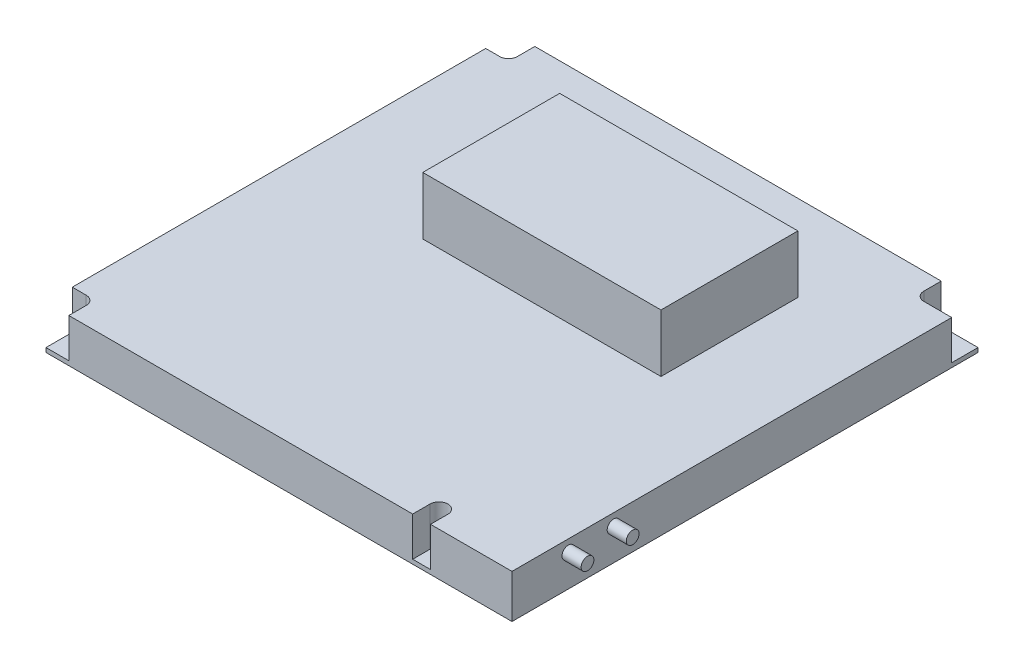
ISO-10303-21;
HEADER;
FILE_DESCRIPTION(('STEP AP214'),'2;1');
FILE_NAME('part.step','',(''),(''),'','','');
FILE_SCHEMA(('AUTOMOTIVE_DESIGN { 1 0 10303 214 1 1 1 1 }'));
ENDSEC;
DATA;
#1=APPLICATION_CONTEXT('core data for automotive mechanical design processes');
#2=APPLICATION_PROTOCOL_DEFINITION('international standard','automotive_design',2000,#1);
#3=PRODUCT_CONTEXT('',#1,'mechanical');
#4=PRODUCT('Part','Part','',(#3));
#5=PRODUCT_RELATED_PRODUCT_CATEGORY('part','',(#4));
#6=PRODUCT_DEFINITION_FORMATION('','',#4);
#7=PRODUCT_DEFINITION_CONTEXT('part definition',#1,'design');
#8=PRODUCT_DEFINITION('design','',#6,#7);
#9=PRODUCT_DEFINITION_SHAPE('','',#8);
#10=(LENGTH_UNIT() NAMED_UNIT(*) SI_UNIT(.MILLI.,.METRE.));
#11=(NAMED_UNIT(*) PLANE_ANGLE_UNIT() SI_UNIT($,.RADIAN.));
#12=(NAMED_UNIT(*) SI_UNIT($,.STERADIAN.) SOLID_ANGLE_UNIT());
#13=UNCERTAINTY_MEASURE_WITH_UNIT(LENGTH_MEASURE(1.E-05),#10,'distance_accuracy_value','');
#14=(GEOMETRIC_REPRESENTATION_CONTEXT(3) GLOBAL_UNCERTAINTY_ASSIGNED_CONTEXT((#13)) GLOBAL_UNIT_ASSIGNED_CONTEXT((#10,
#11,#12)) REPRESENTATION_CONTEXT('',''));
#15=CARTESIAN_POINT('',(0.,0.,0.));
#16=DIRECTION('',(0.,0.,1.));
#17=DIRECTION('',(1.,0.,0.));
#18=AXIS2_PLACEMENT_3D('',#15,#16,#17);
#19=CARTESIAN_POINT('',(0.,15.875,0.));
#20=DIRECTION('',(0.,-1.,0.));
#21=DIRECTION('',(0.,0.,-1.));
#22=AXIS2_PLACEMENT_3D('',#19,#20,#21);
#23=PLANE('',#22);
#24=DIRECTION('',(1.,0.,0.));
#25=VECTOR('',#24,1.);
#26=CARTESIAN_POINT('',(-85.09,15.875,85.09));
#27=LINE('',#26,#25);
#28=CARTESIAN_POINT('',(-76.7588,15.875,85.09));
#29=VERTEX_POINT('',#28);
#30=CARTESIAN_POINT('',(48.8188,15.875,85.09));
#31=VERTEX_POINT('',#30);
#32=EDGE_CURVE('E375',#29,#31,#27,.T.);
#33=ORIENTED_EDGE('',*,*,#32,.T.);
#34=DIRECTION('',(0.,0.,1.));
#35=VECTOR('',#34,1.);
#36=CARTESIAN_POINT('',(48.8188,15.875,78.74));
#37=LINE('',#36,#35);
#38=CARTESIAN_POINT('',(48.8188,15.875,78.74));
#39=VERTEX_POINT('',#38);
#40=EDGE_CURVE('E238',#39,#31,#37,.T.);
#41=ORIENTED_EDGE('',*,*,#40,.F.);
#42=CARTESIAN_POINT('',(52.07,15.875,78.74));
#43=DIRECTION('',(0.,1.,0.));
#44=DIRECTION('',(0.,0.,1.));
#45=AXIS2_PLACEMENT_3D('',#42,#43,#44);
#46=CIRCLE('',#45,3.2512);
#47=CARTESIAN_POINT('',(55.3212,15.875,78.74));
#48=VERTEX_POINT('',#47);
#49=EDGE_CURVE('E240',#48,#39,#46,.T.);
#50=ORIENTED_EDGE('',*,*,#49,.F.);
#51=DIRECTION('',(0.,0.,-1.));
#52=VECTOR('',#51,1.);
#53=CARTESIAN_POINT('',(55.3212,15.875,85.09));
#54=LINE('',#53,#52);
#55=CARTESIAN_POINT('',(55.3212,15.875,85.09));
#56=VERTEX_POINT('',#55);
#57=EDGE_CURVE('E234',#56,#48,#54,.T.);
#58=ORIENTED_EDGE('',*,*,#57,.F.);
#59=CARTESIAN_POINT('',(85.09,15.875,85.09));
#60=VERTEX_POINT('',#59);
#61=EDGE_CURVE('E374',#56,#60,#27,.T.);
#62=ORIENTED_EDGE('',*,*,#61,.T.);
#63=DIRECTION('',(0.,0.,-1.));
#64=VECTOR('',#63,1.);
#65=CARTESIAN_POINT('',(85.09,15.875,85.09));
#66=LINE('',#65,#64);
#67=CARTESIAN_POINT('',(85.09,15.875,-75.4888));
#68=VERTEX_POINT('',#67);
#69=EDGE_CURVE('E365',#60,#68,#66,.T.);
#70=ORIENTED_EDGE('',*,*,#69,.T.);
#71=DIRECTION('',(1.,0.,0.));
#72=VECTOR('',#71,1.);
#73=CARTESIAN_POINT('',(85.09,15.875,-75.4888));
#74=LINE('',#73,#72);
#75=CARTESIAN_POINT('',(74.91000004,15.875,-75.4888));
#76=VERTEX_POINT('',#75);
#77=EDGE_CURVE('E268',#76,#68,#74,.T.);
#78=ORIENTED_EDGE('',*,*,#77,.F.);
#79=CARTESIAN_POINT('',(74.91000004,15.875,-78.74));
#80=DIRECTION('',(0.,1.,0.));
#81=DIRECTION('',(0.,0.,1.));
#82=AXIS2_PLACEMENT_3D('',#79,#80,#81);
#83=CIRCLE('',#82,3.2512);
#84=CARTESIAN_POINT('',(71.65880004,15.875,-78.74));
#85=VERTEX_POINT('',#84);
#86=EDGE_CURVE('E270',#85,#76,#83,.T.);
#87=ORIENTED_EDGE('',*,*,#86,.F.);
#88=DIRECTION('',(0.,0.,1.));
#89=VECTOR('',#88,1.);
#90=CARTESIAN_POINT('',(71.65880004,15.875,-78.74));
#91=LINE('',#90,#89);
#92=CARTESIAN_POINT('',(71.65880004,15.875,-85.09));
#93=VERTEX_POINT('',#92);
#94=EDGE_CURVE('E264',#93,#85,#91,.T.);
#95=ORIENTED_EDGE('',*,*,#94,.F.);
#96=DIRECTION('',(-1.,0.,0.));
#97=VECTOR('',#96,1.);
#98=CARTESIAN_POINT('',(-85.09,15.875,-85.09));
#99=LINE('',#98,#97);
#100=CARTESIAN_POINT('',(-76.7588,15.875,-85.09));
#101=VERTEX_POINT('',#100);
#102=EDGE_CURVE('E368',#93,#101,#99,.T.);
#103=ORIENTED_EDGE('',*,*,#102,.T.);
#104=DIRECTION('',(0.,0.,-1.));
#105=VECTOR('',#104,1.);
#106=CARTESIAN_POINT('',(-76.7588,15.875,-78.74));
#107=LINE('',#106,#105);
#108=CARTESIAN_POINT('',(-76.7588,15.875,-78.74));
#109=VERTEX_POINT('',#108);
#110=EDGE_CURVE('E228',#109,#101,#107,.T.);
#111=ORIENTED_EDGE('',*,*,#110,.F.);
#112=CARTESIAN_POINT('',(-80.01,15.875,-78.74));
#113=DIRECTION('',(0.,1.,0.));
#114=DIRECTION('',(0.,0.,1.));
#115=AXIS2_PLACEMENT_3D('',#112,#113,#114);
#116=CIRCLE('',#115,3.2512);
#117=CARTESIAN_POINT('',(-80.01,15.875,-75.4888));
#118=VERTEX_POINT('',#117);
#119=EDGE_CURVE('E225',#118,#109,#116,.T.);
#120=ORIENTED_EDGE('',*,*,#119,.F.);
#121=DIRECTION('',(1.,0.,0.));
#122=VECTOR('',#121,1.);
#123=CARTESIAN_POINT('',(-85.09,15.875,-75.4888));
#124=LINE('',#123,#122);
#125=CARTESIAN_POINT('',(-85.09,15.875,-75.4888));
#126=VERTEX_POINT('',#125);
#127=EDGE_CURVE('E294',#126,#118,#124,.T.);
#128=ORIENTED_EDGE('',*,*,#127,.F.);
#129=DIRECTION('',(0.,0.,1.));
#130=VECTOR('',#129,1.);
#131=CARTESIAN_POINT('',(-85.09,15.875,85.09));
#132=LINE('',#131,#130);
#133=CARTESIAN_POINT('',(-85.09,15.875,75.4888));
#134=VERTEX_POINT('',#133);
#135=EDGE_CURVE('E372',#126,#134,#132,.T.);
#136=ORIENTED_EDGE('',*,*,#135,.T.);
#137=DIRECTION('',(-1.,0.,0.));
#138=VECTOR('',#137,1.);
#139=CARTESIAN_POINT('',(-80.01,15.875,75.4888));
#140=LINE('',#139,#138);
#141=CARTESIAN_POINT('',(-80.01,15.875,75.4888));
#142=VERTEX_POINT('',#141);
#143=EDGE_CURVE('E323',#142,#134,#140,.T.);
#144=ORIENTED_EDGE('',*,*,#143,.F.);
#145=CARTESIAN_POINT('',(-80.01,15.875,78.74));
#146=DIRECTION('',(0.,1.,0.));
#147=DIRECTION('',(0.,0.,1.));
#148=AXIS2_PLACEMENT_3D('',#145,#146,#147);
#149=CIRCLE('',#148,3.2512);
#150=CARTESIAN_POINT('',(-76.7588,15.875,78.74));
#151=VERTEX_POINT('',#150);
#152=EDGE_CURVE('E326',#151,#142,#149,.T.);
#153=ORIENTED_EDGE('',*,*,#152,.F.);
#154=DIRECTION('',(0.,0.,-1.));
#155=VECTOR('',#154,1.);
#156=CARTESIAN_POINT('',(-76.7588,15.875,85.09));
#157=LINE('',#156,#155);
#158=EDGE_CURVE('E319',#29,#151,#157,.T.);
#159=ORIENTED_EDGE('',*,*,#158,.F.);
#160=EDGE_LOOP('',(#33,#41,#50,#58,#62,#70,#78,#87,#95,#103,#111,#120,#128,#136,#144,#153,#159));
#161=FACE_BOUND('',#160,.T.);
#162=DIRECTION('',(0.,0.,-1.));
#163=VECTOR('',#162,1.);
#164=CARTESIAN_POINT('',(50.669000008,15.875,-3.739999886));
#165=LINE('',#164,#163);
#166=CARTESIAN_POINT('',(50.669000008,15.875,-3.739999886));
#167=VERTEX_POINT('',#166);
#168=CARTESIAN_POINT('',(50.669000008,15.875,-53.739999962));
#169=VERTEX_POINT('',#168);
#170=EDGE_CURVE('E224',#167,#169,#165,.T.);
#171=ORIENTED_EDGE('',*,*,#170,.F.);
#172=DIRECTION('',(1.,0.,0.));
#173=VECTOR('',#172,1.);
#174=CARTESIAN_POINT('',(-36.330999982,15.875,-3.739999886));
#175=LINE('',#174,#173);
#176=CARTESIAN_POINT('',(-36.330999982,15.875,-3.739999886));
#177=VERTEX_POINT('',#176);
#178=EDGE_CURVE('E221',#177,#167,#175,.T.);
#179=ORIENTED_EDGE('',*,*,#178,.F.);
#180=DIRECTION('',(0.,0.,1.));
#181=VECTOR('',#180,1.);
#182=CARTESIAN_POINT('',(-36.330999982,15.875,-3.739999886));
#183=LINE('',#182,#181);
#184=CARTESIAN_POINT('',(-36.330999982,15.875,-53.739999962));
#185=VERTEX_POINT('',#184);
#186=EDGE_CURVE('E63',#185,#177,#183,.T.);
#187=ORIENTED_EDGE('',*,*,#186,.F.);
#188=DIRECTION('',(-1.,0.,0.));
#189=VECTOR('',#188,1.);
#190=CARTESIAN_POINT('',(-36.330999982,15.875,-53.739999962));
#191=LINE('',#190,#189);
#192=EDGE_CURVE('E58',#169,#185,#191,.T.);
#193=ORIENTED_EDGE('',*,*,#192,.F.);
#194=EDGE_LOOP('',(#171,#179,#187,#193));
#195=FACE_BOUND('',#194,.T.);
#196=ADVANCED_FACE('F43',(#161,#195),#23,.F.);
#197=CARTESIAN_POINT('',(0.,0.,0.));
#198=DIRECTION('',(0.,-1.,0.));
#199=DIRECTION('',(0.,0.,-1.));
#200=AXIS2_PLACEMENT_3D('',#197,#198,#199);
#201=PLANE('',#200);
#202=CARTESIAN_POINT('',(-80.01,0.,78.74));
#203=DIRECTION('',(0.,1.,0.));
#204=DIRECTION('',(0.,0.,1.));
#205=AXIS2_PLACEMENT_3D('',#202,#203,#204);
#206=CIRCLE('',#205,1.9750024);
#207=CARTESIAN_POINT('',(-80.01,0.,80.7150024));
#208=VERTEX_POINT('',#207);
#209=EDGE_CURVE('E355',#208,#208,#206,.T.);
#210=ORIENTED_EDGE('',*,*,#209,.T.);
#211=EDGE_LOOP('',(#210));
#212=FACE_BOUND('',#211,.T.);
#213=CARTESIAN_POINT('',(-80.01,0.,-78.74));
#214=DIRECTION('',(0.,1.,0.));
#215=DIRECTION('',(0.,0.,1.));
#216=AXIS2_PLACEMENT_3D('',#213,#214,#215);
#217=CIRCLE('',#216,1.9750024);
#218=CARTESIAN_POINT('',(-80.01,0.,-76.7649976));
#219=VERTEX_POINT('',#218);
#220=EDGE_CURVE('E361',#219,#219,#217,.T.);
#221=ORIENTED_EDGE('',*,*,#220,.T.);
#222=EDGE_LOOP('',(#221));
#223=FACE_BOUND('',#222,.T.);
#224=DIRECTION('',(0.,0.,-1.));
#225=VECTOR('',#224,1.);
#226=CARTESIAN_POINT('',(85.09,0.,85.09));
#227=LINE('',#226,#225);
#228=CARTESIAN_POINT('',(85.09,0.,85.09));
#229=VERTEX_POINT('',#228);
#230=CARTESIAN_POINT('',(85.09,0.,-85.09));
#231=VERTEX_POINT('',#230);
#232=EDGE_CURVE('E364',#229,#231,#227,.T.);
#233=ORIENTED_EDGE('',*,*,#232,.F.);
#234=DIRECTION('',(1.,0.,0.));
#235=VECTOR('',#234,1.);
#236=CARTESIAN_POINT('',(-85.09,0.,85.09));
#237=LINE('',#236,#235);
#238=CARTESIAN_POINT('',(-85.09,0.,85.09));
#239=VERTEX_POINT('',#238);
#240=EDGE_CURVE('E369',#239,#229,#237,.T.);
#241=ORIENTED_EDGE('',*,*,#240,.F.);
#242=DIRECTION('',(0.,0.,1.));
#243=VECTOR('',#242,1.);
#244=CARTESIAN_POINT('',(-85.09,0.,85.09));
#245=LINE('',#244,#243);
#246=CARTESIAN_POINT('',(-85.09,0.,-85.09));
#247=VERTEX_POINT('',#246);
#248=EDGE_CURVE('E384',#247,#239,#245,.T.);
#249=ORIENTED_EDGE('',*,*,#248,.F.);
#250=DIRECTION('',(-1.,0.,0.));
#251=VECTOR('',#250,1.);
#252=CARTESIAN_POINT('',(-85.09,0.,-85.09));
#253=LINE('',#252,#251);
#254=EDGE_CURVE('E381',#231,#247,#253,.T.);
#255=ORIENTED_EDGE('',*,*,#254,.F.);
#256=EDGE_LOOP('',(#233,#241,#249,#255));
#257=FACE_BOUND('',#256,.T.);
#258=CARTESIAN_POINT('',(74.91000004,0.,-78.74));
#259=DIRECTION('',(0.,1.,0.));
#260=DIRECTION('',(0.,0.,1.));
#261=AXIS2_PLACEMENT_3D('',#258,#259,#260);
#262=CIRCLE('',#261,1.9750024);
#263=CARTESIAN_POINT('',(74.91000004,0.,-76.7649976));
#264=VERTEX_POINT('',#263);
#265=EDGE_CURVE('E358',#264,#264,#262,.T.);
#266=ORIENTED_EDGE('',*,*,#265,.T.);
#267=EDGE_LOOP('',(#266));
#268=FACE_BOUND('',#267,.T.);
#269=CARTESIAN_POINT('',(52.07,0.,78.74));
#270=DIRECTION('',(0.,1.,0.));
#271=DIRECTION('',(0.,0.,1.));
#272=AXIS2_PLACEMENT_3D('',#269,#270,#271);
#273=CIRCLE('',#272,1.974999987);
#274=CARTESIAN_POINT('',(52.07,0.,80.714999987));
#275=VERTEX_POINT('',#274);
#276=EDGE_CURVE('E352',#275,#275,#273,.T.);
#277=ORIENTED_EDGE('',*,*,#276,.T.);
#278=EDGE_LOOP('',(#277));
#279=FACE_BOUND('',#278,.T.);
#280=ADVANCED_FACE('F412',(#212,#223,#257,#268,#279),#201,.T.);
#281=CARTESIAN_POINT('',(85.09,15.875,85.09));
#282=DIRECTION('',(-1.,0.,0.));
#283=DIRECTION('',(0.,0.,1.));
#284=AXIS2_PLACEMENT_3D('',#281,#282,#283);
#285=PLANE('',#284);
#286=CARTESIAN_POINT('',(85.09,11.574999964,48.009999992));
#287=DIRECTION('',(-1.,0.,0.));
#288=DIRECTION('',(0.,0.,1.));
#289=AXIS2_PLACEMENT_3D('',#286,#287,#288);
#290=CIRCLE('',#289,2.325000049);
#291=CARTESIAN_POINT('',(85.09,11.574999964,50.335000041));
#292=VERTEX_POINT('',#291);
#293=EDGE_CURVE('E12',#292,#292,#290,.F.);
#294=ORIENTED_EDGE('',*,*,#293,.F.);
#295=EDGE_LOOP('',(#294));
#296=FACE_BOUND('',#295,.T.);
#297=CARTESIAN_POINT('',(85.09,11.574999964,64.510000012));
#298=DIRECTION('',(-1.,0.,0.));
#299=DIRECTION('',(0.,0.,1.));
#300=AXIS2_PLACEMENT_3D('',#297,#298,#299);
#301=CIRCLE('',#300,2.32500004900001);
#302=CARTESIAN_POINT('',(85.09,11.574999964,66.835000061));
#303=VERTEX_POINT('',#302);
#304=EDGE_CURVE('E51',#303,#303,#301,.F.);
#305=ORIENTED_EDGE('',*,*,#304,.F.);
#306=EDGE_LOOP('',(#305));
#307=FACE_BOUND('',#306,.T.);
#308=DIRECTION('',(0.,-1.,0.));
#309=VECTOR('',#308,1.);
#310=CARTESIAN_POINT('',(85.09,15.875,-85.09));
#311=LINE('',#310,#309);
#312=CARTESIAN_POINT('',(85.09,1.574999898,-85.09));
#313=VERTEX_POINT('',#312);
#314=EDGE_CURVE('E394',#313,#231,#311,.T.);
#315=ORIENTED_EDGE('',*,*,#314,.F.);
#316=DIRECTION('',(0.,0.,-1.));
#317=VECTOR('',#316,1.);
#318=CARTESIAN_POINT('',(85.09,1.574999898,-85.09));
#319=LINE('',#318,#317);
#320=CARTESIAN_POINT('',(85.09,1.574999898,-75.4888));
#321=VERTEX_POINT('',#320);
#322=EDGE_CURVE('E287',#321,#313,#319,.T.);
#323=ORIENTED_EDGE('',*,*,#322,.F.);
#324=DIRECTION('',(0.,1.,0.));
#325=VECTOR('',#324,1.);
#326=CARTESIAN_POINT('',(85.09,-16.5100022351756,-75.4888));
#327=LINE('',#326,#325);
#328=EDGE_CURVE('E276',#321,#68,#327,.T.);
#329=ORIENTED_EDGE('',*,*,#328,.T.);
#330=ORIENTED_EDGE('',*,*,#69,.F.);
#331=DIRECTION('',(0.,-1.,0.));
#332=VECTOR('',#331,1.);
#333=CARTESIAN_POINT('',(85.09,15.875,85.09));
#334=LINE('',#333,#332);
#335=EDGE_CURVE('E378',#60,#229,#334,.T.);
#336=ORIENTED_EDGE('',*,*,#335,.T.);
#337=ORIENTED_EDGE('',*,*,#232,.T.);
#338=EDGE_LOOP('',(#315,#323,#329,#330,#336,#337));
#339=FACE_BOUND('',#338,.T.);
#340=ADVANCED_FACE('F45',(#296,#307,#339),#285,.F.);
#341=CARTESIAN_POINT('',(-85.09,15.875,-85.09));
#342=DIRECTION('',(0.,0.,1.));
#343=DIRECTION('',(1.,0.,0.));
#344=AXIS2_PLACEMENT_3D('',#341,#342,#343);
#345=PLANE('',#344);
#346=DIRECTION('',(0.,1.,0.));
#347=VECTOR('',#346,1.);
#348=CARTESIAN_POINT('',(71.65880004,-16.5100022351756,-85.09));
#349=LINE('',#348,#347);
#350=CARTESIAN_POINT('',(71.65880004,1.574999898,-85.09));
#351=VERTEX_POINT('',#350);
#352=EDGE_CURVE('E284',#351,#93,#349,.T.);
#353=ORIENTED_EDGE('',*,*,#352,.F.);
#354=DIRECTION('',(-1.,0.,0.));
#355=VECTOR('',#354,1.);
#356=CARTESIAN_POINT('',(71.65880004,1.574999898,-85.09));
#357=LINE('',#356,#355);
#358=EDGE_CURVE('E285',#313,#351,#357,.T.);
#359=ORIENTED_EDGE('',*,*,#358,.F.);
#360=ORIENTED_EDGE('',*,*,#314,.T.);
#361=ORIENTED_EDGE('',*,*,#254,.T.);
#362=DIRECTION('',(0.,-1.,0.));
#363=VECTOR('',#362,1.);
#364=CARTESIAN_POINT('',(-85.09,15.875,-85.09));
#365=LINE('',#364,#363);
#366=CARTESIAN_POINT('',(-85.09,1.574999898,-85.09));
#367=VERTEX_POINT('',#366);
#368=EDGE_CURVE('E392',#367,#247,#365,.T.);
#369=ORIENTED_EDGE('',*,*,#368,.F.);
#370=DIRECTION('',(-1.,0.,0.));
#371=VECTOR('',#370,1.);
#372=CARTESIAN_POINT('',(-76.7588,1.574999898,-85.09));
#373=LINE('',#372,#371);
#374=CARTESIAN_POINT('',(-76.7588,1.574999898,-85.09));
#375=VERTEX_POINT('',#374);
#376=EDGE_CURVE('E312',#375,#367,#373,.T.);
#377=ORIENTED_EDGE('',*,*,#376,.F.);
#378=DIRECTION('',(0.,1.,0.));
#379=VECTOR('',#378,1.);
#380=CARTESIAN_POINT('',(-76.7588,-16.5100022351756,-85.09));
#381=LINE('',#380,#379);
#382=EDGE_CURVE('E301',#375,#101,#381,.T.);
#383=ORIENTED_EDGE('',*,*,#382,.T.);
#384=ORIENTED_EDGE('',*,*,#102,.F.);
#385=EDGE_LOOP('',(#353,#359,#360,#361,#369,#377,#383,#384));
#386=FACE_BOUND('',#385,.T.);
#387=ADVANCED_FACE('F411',(#386),#345,.F.);
#388=CARTESIAN_POINT('',(-85.09,15.875,85.09));
#389=DIRECTION('',(1.,0.,0.));
#390=DIRECTION('',(0.,0.,-1.));
#391=AXIS2_PLACEMENT_3D('',#388,#389,#390);
#392=PLANE('',#391);
#393=DIRECTION('',(0.,1.,0.));
#394=VECTOR('',#393,1.);
#395=CARTESIAN_POINT('',(-85.09,-16.5100022351756,-75.4888));
#396=LINE('',#395,#394);
#397=CARTESIAN_POINT('',(-85.09,1.574999898,-75.4888));
#398=VERTEX_POINT('',#397);
#399=EDGE_CURVE('E309',#398,#126,#396,.T.);
#400=ORIENTED_EDGE('',*,*,#399,.F.);
#401=DIRECTION('',(0.,0.,1.));
#402=VECTOR('',#401,1.);
#403=CARTESIAN_POINT('',(-85.09,1.574999898,-85.09));
#404=LINE('',#403,#402);
#405=EDGE_CURVE('E310',#367,#398,#404,.T.);
#406=ORIENTED_EDGE('',*,*,#405,.F.);
#407=ORIENTED_EDGE('',*,*,#368,.T.);
#408=ORIENTED_EDGE('',*,*,#248,.T.);
#409=DIRECTION('',(0.,-1.,0.));
#410=VECTOR('',#409,1.);
#411=CARTESIAN_POINT('',(-85.09,15.875,85.09));
#412=LINE('',#411,#410);
#413=CARTESIAN_POINT('',(-85.09,1.574999898,85.09));
#414=VERTEX_POINT('',#413);
#415=EDGE_CURVE('E390',#414,#239,#412,.T.);
#416=ORIENTED_EDGE('',*,*,#415,.F.);
#417=DIRECTION('',(0.,0.,1.));
#418=VECTOR('',#417,1.);
#419=CARTESIAN_POINT('',(-85.09,1.574999898,75.4888));
#420=LINE('',#419,#418);
#421=CARTESIAN_POINT('',(-85.09,1.574999898,75.4888));
#422=VERTEX_POINT('',#421);
#423=EDGE_CURVE('E344',#422,#414,#420,.T.);
#424=ORIENTED_EDGE('',*,*,#423,.F.);
#425=DIRECTION('',(0.,1.,0.));
#426=VECTOR('',#425,1.);
#427=CARTESIAN_POINT('',(-85.09,-16.5100022351756,75.4888));
#428=LINE('',#427,#426);
#429=EDGE_CURVE('E332',#422,#134,#428,.T.);
#430=ORIENTED_EDGE('',*,*,#429,.T.);
#431=ORIENTED_EDGE('',*,*,#135,.F.);
#432=EDGE_LOOP('',(#400,#406,#407,#408,#416,#424,#430,#431));
#433=FACE_BOUND('',#432,.T.);
#434=ADVANCED_FACE('F429',(#433),#392,.F.);
#435=CARTESIAN_POINT('',(-85.09,15.875,85.09));
#436=DIRECTION('',(0.,0.,-1.));
#437=DIRECTION('',(-1.,0.,0.));
#438=AXIS2_PLACEMENT_3D('',#435,#436,#437);
#439=PLANE('',#438);
#440=DIRECTION('',(1.,0.,0.));
#441=VECTOR('',#440,1.);
#442=CARTESIAN_POINT('',(48.8188,1.574999898,85.09));
#443=LINE('',#442,#441);
#444=CARTESIAN_POINT('',(48.8188,1.574999898,85.09));
#445=VERTEX_POINT('',#444);
#446=CARTESIAN_POINT('',(55.3212,1.574999898,85.09));
#447=VERTEX_POINT('',#446);
#448=EDGE_CURVE('E256',#445,#447,#443,.T.);
#449=ORIENTED_EDGE('',*,*,#448,.F.);
#450=DIRECTION('',(0.,1.,0.));
#451=VECTOR('',#450,1.);
#452=CARTESIAN_POINT('',(48.8188,-16.5100022351756,85.09));
#453=LINE('',#452,#451);
#454=EDGE_CURVE('E246',#445,#31,#453,.T.);
#455=ORIENTED_EDGE('',*,*,#454,.T.);
#456=ORIENTED_EDGE('',*,*,#32,.F.);
#457=DIRECTION('',(0.,1.,0.));
#458=VECTOR('',#457,1.);
#459=CARTESIAN_POINT('',(-76.7588,-16.5100022351756,85.09));
#460=LINE('',#459,#458);
#461=CARTESIAN_POINT('',(-76.7588,1.574999898,85.09));
#462=VERTEX_POINT('',#461);
#463=EDGE_CURVE('E341',#462,#29,#460,.T.);
#464=ORIENTED_EDGE('',*,*,#463,.F.);
#465=DIRECTION('',(1.,0.,0.));
#466=VECTOR('',#465,1.);
#467=CARTESIAN_POINT('',(-85.09,1.574999898,85.09));
#468=LINE('',#467,#466);
#469=EDGE_CURVE('E342',#414,#462,#468,.T.);
#470=ORIENTED_EDGE('',*,*,#469,.F.);
#471=ORIENTED_EDGE('',*,*,#415,.T.);
#472=ORIENTED_EDGE('',*,*,#240,.T.);
#473=ORIENTED_EDGE('',*,*,#335,.F.);
#474=ORIENTED_EDGE('',*,*,#61,.F.);
#475=DIRECTION('',(0.,1.,0.));
#476=VECTOR('',#475,1.);
#477=CARTESIAN_POINT('',(55.3212,-16.5100022351756,85.09));
#478=LINE('',#477,#476);
#479=EDGE_CURVE('E255',#447,#56,#478,.T.);
#480=ORIENTED_EDGE('',*,*,#479,.F.);
#481=EDGE_LOOP('',(#449,#455,#456,#464,#470,#471,#472,#473,#474,#480));
#482=FACE_BOUND('',#481,.T.);
#483=ADVANCED_FACE('F464',(#482),#439,.F.);
#484=CARTESIAN_POINT('',(-80.01,15.875,-78.74));
#485=DIRECTION('',(0.,-1.,0.));
#486=DIRECTION('',(0.,0.,-1.));
#487=AXIS2_PLACEMENT_3D('',#484,#485,#486);
#488=CYLINDRICAL_SURFACE('',#487,1.9750024);
#489=CARTESIAN_POINT('',(-80.01,1.574999898,-78.74));
#490=DIRECTION('',(0.,-1.,0.));
#491=DIRECTION('',(0.,0.,-1.));
#492=AXIS2_PLACEMENT_3D('',#489,#490,#491);
#493=CIRCLE('',#492,1.9750024);
#494=CARTESIAN_POINT('',(-80.01,1.574999898,-80.7150024));
#495=VERTEX_POINT('',#494);
#496=EDGE_CURVE('E329',#495,#495,#493,.T.);
#497=ORIENTED_EDGE('',*,*,#496,.F.);
#498=EDGE_LOOP('',(#497));
#499=FACE_BOUND('',#498,.T.);
#500=ORIENTED_EDGE('',*,*,#220,.F.);
#501=EDGE_LOOP('',(#500));
#502=FACE_BOUND('',#501,.T.);
#503=ADVANCED_FACE('F505',(#499,#502),#488,.F.);
#504=CARTESIAN_POINT('',(74.91000004,15.875,-78.74));
#505=DIRECTION('',(0.,-1.,0.));
#506=DIRECTION('',(0.,0.,-1.));
#507=AXIS2_PLACEMENT_3D('',#504,#505,#506);
#508=CYLINDRICAL_SURFACE('',#507,1.9750024);
#509=CARTESIAN_POINT('',(74.91000004,1.574999898,-78.74));
#510=DIRECTION('',(0.,-1.,0.));
#511=DIRECTION('',(0.,0.,-1.));
#512=AXIS2_PLACEMENT_3D('',#509,#510,#511);
#513=CIRCLE('',#512,1.9750024);
#514=CARTESIAN_POINT('',(74.91000004,1.574999898,-80.7150024));
#515=VERTEX_POINT('',#514);
#516=EDGE_CURVE('E400',#515,#515,#513,.T.);
#517=ORIENTED_EDGE('',*,*,#516,.F.);
#518=EDGE_LOOP('',(#517));
#519=FACE_BOUND('',#518,.T.);
#520=ORIENTED_EDGE('',*,*,#265,.F.);
#521=EDGE_LOOP('',(#520));
#522=FACE_BOUND('',#521,.T.);
#523=ADVANCED_FACE('F531',(#519,#522),#508,.F.);
#524=CARTESIAN_POINT('',(-80.01,15.875,78.74));
#525=DIRECTION('',(0.,-1.,0.));
#526=DIRECTION('',(0.,0.,-1.));
#527=AXIS2_PLACEMENT_3D('',#524,#525,#526);
#528=CYLINDRICAL_SURFACE('',#527,1.9750024);
#529=CARTESIAN_POINT('',(-80.01,1.574999898,78.74));
#530=DIRECTION('',(0.,-1.,0.));
#531=DIRECTION('',(0.,0.,-1.));
#532=AXIS2_PLACEMENT_3D('',#529,#530,#531);
#533=CIRCLE('',#532,1.9750024);
#534=CARTESIAN_POINT('',(-80.01,1.574999898,76.7649976));
#535=VERTEX_POINT('',#534);
#536=EDGE_CURVE('E351',#535,#535,#533,.T.);
#537=ORIENTED_EDGE('',*,*,#536,.F.);
#538=EDGE_LOOP('',(#537));
#539=FACE_BOUND('',#538,.T.);
#540=ORIENTED_EDGE('',*,*,#209,.F.);
#541=EDGE_LOOP('',(#540));
#542=FACE_BOUND('',#541,.T.);
#543=ADVANCED_FACE('F538',(#539,#542),#528,.F.);
#544=CARTESIAN_POINT('',(52.07,15.875,78.74));
#545=DIRECTION('',(0.,-1.,0.));
#546=DIRECTION('',(0.,0.,-1.));
#547=AXIS2_PLACEMENT_3D('',#544,#545,#546);
#548=CYLINDRICAL_SURFACE('',#547,1.974999987);
#549=CARTESIAN_POINT('',(52.07,1.574999898,78.74));
#550=DIRECTION('',(0.,-1.,0.));
#551=DIRECTION('',(0.,0.,-1.));
#552=AXIS2_PLACEMENT_3D('',#549,#550,#551);
#553=CIRCLE('',#552,1.974999987);
#554=CARTESIAN_POINT('',(52.07,1.574999898,76.765000013));
#555=VERTEX_POINT('',#554);
#556=EDGE_CURVE('E263',#555,#555,#553,.T.);
#557=ORIENTED_EDGE('',*,*,#556,.F.);
#558=EDGE_LOOP('',(#557));
#559=FACE_BOUND('',#558,.T.);
#560=ORIENTED_EDGE('',*,*,#276,.F.);
#561=EDGE_LOOP('',(#560));
#562=FACE_BOUND('',#561,.T.);
#563=ADVANCED_FACE('F545',(#559,#562),#548,.F.);
#564=CARTESIAN_POINT('',(0.,1.574999898,0.));
#565=DIRECTION('',(0.,-1.,0.));
#566=DIRECTION('',(0.,0.,-1.));
#567=AXIS2_PLACEMENT_3D('',#564,#565,#566);
#568=PLANE('',#567);
#569=ORIENTED_EDGE('',*,*,#536,.T.);
#570=EDGE_LOOP('',(#569));
#571=FACE_BOUND('',#570,.T.);
#572=CARTESIAN_POINT('',(-80.01,1.574999898,78.74));
#573=DIRECTION('',(0.,-1.,0.));
#574=DIRECTION('',(0.,0.,-1.));
#575=AXIS2_PLACEMENT_3D('',#572,#573,#574);
#576=CIRCLE('',#575,3.2512);
#577=CARTESIAN_POINT('',(-76.7588,1.574999898,78.74));
#578=VERTEX_POINT('',#577);
#579=CARTESIAN_POINT('',(-80.01,1.574999898,75.4888));
#580=VERTEX_POINT('',#579);
#581=EDGE_CURVE('E333',#578,#580,#576,.F.);
#582=ORIENTED_EDGE('',*,*,#581,.T.);
#583=DIRECTION('',(-1.,0.,0.));
#584=VECTOR('',#583,1.);
#585=CARTESIAN_POINT('',(-80.01,1.574999898,75.4888));
#586=LINE('',#585,#584);
#587=EDGE_CURVE('E322',#580,#422,#586,.T.);
#588=ORIENTED_EDGE('',*,*,#587,.T.);
#589=ORIENTED_EDGE('',*,*,#423,.T.);
#590=ORIENTED_EDGE('',*,*,#469,.T.);
#591=DIRECTION('',(0.,0.,-1.));
#592=VECTOR('',#591,1.);
#593=CARTESIAN_POINT('',(-76.7588,1.574999898,85.09));
#594=LINE('',#593,#592);
#595=EDGE_CURVE('E338',#462,#578,#594,.T.);
#596=ORIENTED_EDGE('',*,*,#595,.T.);
#597=EDGE_LOOP('',(#582,#588,#589,#590,#596));
#598=FACE_BOUND('',#597,.T.);
#599=ADVANCED_FACE('F470',(#571,#598),#568,.F.);
#600=CARTESIAN_POINT('',(-80.01,-16.5100022351756,75.4888));
#601=DIRECTION('',(0.,0.,-1.));
#602=DIRECTION('',(-1.,0.,0.));
#603=AXIS2_PLACEMENT_3D('',#600,#601,#602);
#604=PLANE('',#603);
#605=DIRECTION('',(0.,1.,0.));
#606=VECTOR('',#605,1.);
#607=CARTESIAN_POINT('',(-80.01,-16.5100022351756,75.4888));
#608=LINE('',#607,#606);
#609=EDGE_CURVE('E336',#580,#142,#608,.T.);
#610=ORIENTED_EDGE('',*,*,#609,.T.);
#611=ORIENTED_EDGE('',*,*,#143,.T.);
#612=ORIENTED_EDGE('',*,*,#429,.F.);
#613=ORIENTED_EDGE('',*,*,#587,.F.);
#614=EDGE_LOOP('',(#610,#611,#612,#613));
#615=FACE_BOUND('',#614,.T.);
#616=ADVANCED_FACE('F482',(#615),#604,.F.);
#617=CARTESIAN_POINT('',(-76.7588,-16.5100022351756,85.09));
#618=DIRECTION('',(1.,0.,0.));
#619=DIRECTION('',(0.,0.,-1.));
#620=AXIS2_PLACEMENT_3D('',#617,#618,#619);
#621=PLANE('',#620);
#622=ORIENTED_EDGE('',*,*,#463,.T.);
#623=ORIENTED_EDGE('',*,*,#158,.T.);
#624=DIRECTION('',(0.,1.,0.));
#625=VECTOR('',#624,1.);
#626=CARTESIAN_POINT('',(-76.7588,-16.5100022351756,78.74));
#627=LINE('',#626,#625);
#628=EDGE_CURVE('E337',#578,#151,#627,.T.);
#629=ORIENTED_EDGE('',*,*,#628,.F.);
#630=ORIENTED_EDGE('',*,*,#595,.F.);
#631=EDGE_LOOP('',(#622,#623,#629,#630));
#632=FACE_BOUND('',#631,.T.);
#633=ADVANCED_FACE('F473',(#632),#621,.F.);
#634=CARTESIAN_POINT('',(-80.01,-16.5100022351756,78.74));
#635=DIRECTION('',(0.,1.,0.));
#636=DIRECTION('',(0.,0.,1.));
#637=AXIS2_PLACEMENT_3D('',#634,#635,#636);
#638=CYLINDRICAL_SURFACE('',#637,3.2512);
#639=ORIENTED_EDGE('',*,*,#628,.T.);
#640=ORIENTED_EDGE('',*,*,#152,.T.);
#641=ORIENTED_EDGE('',*,*,#609,.F.);
#642=ORIENTED_EDGE('',*,*,#581,.F.);
#643=EDGE_LOOP('',(#639,#640,#641,#642));
#644=FACE_BOUND('',#643,.T.);
#645=ADVANCED_FACE('F477',(#644),#638,.F.);
#646=CARTESIAN_POINT('',(0.,1.574999898,0.));
#647=DIRECTION('',(0.,-1.,0.));
#648=DIRECTION('',(0.,0.,-1.));
#649=AXIS2_PLACEMENT_3D('',#646,#647,#648);
#650=PLANE('',#649);
#651=ORIENTED_EDGE('',*,*,#556,.T.);
#652=EDGE_LOOP('',(#651));
#653=FACE_BOUND('',#652,.T.);
#654=CARTESIAN_POINT('',(52.07,1.574999898,78.74));
#655=DIRECTION('',(0.,-1.,0.));
#656=DIRECTION('',(0.,0.,-1.));
#657=AXIS2_PLACEMENT_3D('',#654,#655,#656);
#658=CIRCLE('',#657,3.2512);
#659=CARTESIAN_POINT('',(55.3212,1.574999898,78.74));
#660=VERTEX_POINT('',#659);
#661=CARTESIAN_POINT('',(48.8188,1.574999898,78.74));
#662=VERTEX_POINT('',#661);
#663=EDGE_CURVE('E247',#660,#662,#658,.F.);
#664=ORIENTED_EDGE('',*,*,#663,.T.);
#665=DIRECTION('',(0.,0.,1.));
#666=VECTOR('',#665,1.);
#667=CARTESIAN_POINT('',(48.8188,1.574999898,78.74));
#668=LINE('',#667,#666);
#669=EDGE_CURVE('E237',#662,#445,#668,.T.);
#670=ORIENTED_EDGE('',*,*,#669,.T.);
#671=ORIENTED_EDGE('',*,*,#448,.T.);
#672=DIRECTION('',(0.,0.,-1.));
#673=VECTOR('',#672,1.);
#674=CARTESIAN_POINT('',(55.3212,1.574999898,85.09));
#675=LINE('',#674,#673);
#676=EDGE_CURVE('E252',#447,#660,#675,.T.);
#677=ORIENTED_EDGE('',*,*,#676,.T.);
#678=EDGE_LOOP('',(#664,#670,#671,#677));
#679=FACE_BOUND('',#678,.T.);
#680=ADVANCED_FACE('F579',(#653,#679),#650,.F.);
#681=CARTESIAN_POINT('',(48.8188,-16.5100022351756,78.74));
#682=DIRECTION('',(-1.,0.,0.));
#683=DIRECTION('',(0.,0.,1.));
#684=AXIS2_PLACEMENT_3D('',#681,#682,#683);
#685=PLANE('',#684);
#686=DIRECTION('',(0.,1.,0.));
#687=VECTOR('',#686,1.);
#688=CARTESIAN_POINT('',(48.8188,-16.5100022351756,78.74));
#689=LINE('',#688,#687);
#690=EDGE_CURVE('E250',#662,#39,#689,.T.);
#691=ORIENTED_EDGE('',*,*,#690,.T.);
#692=ORIENTED_EDGE('',*,*,#40,.T.);
#693=ORIENTED_EDGE('',*,*,#454,.F.);
#694=ORIENTED_EDGE('',*,*,#669,.F.);
#695=EDGE_LOOP('',(#691,#692,#693,#694));
#696=FACE_BOUND('',#695,.T.);
#697=ADVANCED_FACE('F586',(#696),#685,.F.);
#698=CARTESIAN_POINT('',(55.3212,-16.5100022351756,85.09));
#699=DIRECTION('',(1.,0.,0.));
#700=DIRECTION('',(0.,0.,-1.));
#701=AXIS2_PLACEMENT_3D('',#698,#699,#700);
#702=PLANE('',#701);
#703=ORIENTED_EDGE('',*,*,#479,.T.);
#704=ORIENTED_EDGE('',*,*,#57,.T.);
#705=DIRECTION('',(0.,1.,0.));
#706=VECTOR('',#705,1.);
#707=CARTESIAN_POINT('',(55.3212,-16.5100022351756,78.74));
#708=LINE('',#707,#706);
#709=EDGE_CURVE('E251',#660,#48,#708,.T.);
#710=ORIENTED_EDGE('',*,*,#709,.F.);
#711=ORIENTED_EDGE('',*,*,#676,.F.);
#712=EDGE_LOOP('',(#703,#704,#710,#711));
#713=FACE_BOUND('',#712,.T.);
#714=ADVANCED_FACE('F594',(#713),#702,.F.);
#715=CARTESIAN_POINT('',(52.07,-16.5100022351756,78.74));
#716=DIRECTION('',(0.,1.,0.));
#717=DIRECTION('',(0.,0.,1.));
#718=AXIS2_PLACEMENT_3D('',#715,#716,#717);
#719=CYLINDRICAL_SURFACE('',#718,3.2512);
#720=ORIENTED_EDGE('',*,*,#709,.T.);
#721=ORIENTED_EDGE('',*,*,#49,.T.);
#722=ORIENTED_EDGE('',*,*,#690,.F.);
#723=ORIENTED_EDGE('',*,*,#663,.F.);
#724=EDGE_LOOP('',(#720,#721,#722,#723));
#725=FACE_BOUND('',#724,.T.);
#726=ADVANCED_FACE('F602',(#725),#719,.F.);
#727=CARTESIAN_POINT('',(0.,1.574999898,0.));
#728=DIRECTION('',(0.,-1.,0.));
#729=DIRECTION('',(0.,0.,-1.));
#730=AXIS2_PLACEMENT_3D('',#727,#728,#729);
#731=PLANE('',#730);
#732=ORIENTED_EDGE('',*,*,#516,.T.);
#733=EDGE_LOOP('',(#732));
#734=FACE_BOUND('',#733,.T.);
#735=CARTESIAN_POINT('',(74.91000004,1.574999898,-78.74));
#736=DIRECTION('',(0.,-1.,0.));
#737=DIRECTION('',(0.,0.,-1.));
#738=AXIS2_PLACEMENT_3D('',#735,#736,#737);
#739=CIRCLE('',#738,3.2512);
#740=CARTESIAN_POINT('',(71.65880004,1.574999898,-78.74));
#741=VERTEX_POINT('',#740);
#742=CARTESIAN_POINT('',(74.91000004,1.574999898,-75.4888));
#743=VERTEX_POINT('',#742);
#744=EDGE_CURVE('E277',#741,#743,#739,.F.);
#745=ORIENTED_EDGE('',*,*,#744,.T.);
#746=DIRECTION('',(1.,0.,0.));
#747=VECTOR('',#746,1.);
#748=CARTESIAN_POINT('',(85.09,1.574999898,-75.4888));
#749=LINE('',#748,#747);
#750=EDGE_CURVE('E267',#743,#321,#749,.T.);
#751=ORIENTED_EDGE('',*,*,#750,.T.);
#752=ORIENTED_EDGE('',*,*,#322,.T.);
#753=ORIENTED_EDGE('',*,*,#358,.T.);
#754=DIRECTION('',(0.,0.,1.));
#755=VECTOR('',#754,1.);
#756=CARTESIAN_POINT('',(71.65880004,1.574999898,-78.74));
#757=LINE('',#756,#755);
#758=EDGE_CURVE('E281',#351,#741,#757,.T.);
#759=ORIENTED_EDGE('',*,*,#758,.T.);
#760=EDGE_LOOP('',(#745,#751,#752,#753,#759));
#761=FACE_BOUND('',#760,.T.);
#762=ADVANCED_FACE('F451',(#734,#761),#731,.F.);
#763=CARTESIAN_POINT('',(85.09,-16.5100022351756,-75.4888));
#764=DIRECTION('',(0.,0.,1.));
#765=DIRECTION('',(1.,0.,0.));
#766=AXIS2_PLACEMENT_3D('',#763,#764,#765);
#767=PLANE('',#766);
#768=DIRECTION('',(0.,1.,0.));
#769=VECTOR('',#768,1.);
#770=CARTESIAN_POINT('',(74.91000004,-16.5100022351756,-75.4888));
#771=LINE('',#770,#769);
#772=EDGE_CURVE('E243',#743,#76,#771,.T.);
#773=ORIENTED_EDGE('',*,*,#772,.T.);
#774=ORIENTED_EDGE('',*,*,#77,.T.);
#775=ORIENTED_EDGE('',*,*,#328,.F.);
#776=ORIENTED_EDGE('',*,*,#750,.F.);
#777=EDGE_LOOP('',(#773,#774,#775,#776));
#778=FACE_BOUND('',#777,.T.);
#779=ADVANCED_FACE('F454',(#778),#767,.F.);
#780=CARTESIAN_POINT('',(71.65880004,-16.5100022351756,-78.74));
#781=DIRECTION('',(-1.,0.,0.));
#782=DIRECTION('',(0.,0.,1.));
#783=AXIS2_PLACEMENT_3D('',#780,#781,#782);
#784=PLANE('',#783);
#785=ORIENTED_EDGE('',*,*,#352,.T.);
#786=ORIENTED_EDGE('',*,*,#94,.T.);
#787=DIRECTION('',(0.,1.,0.));
#788=VECTOR('',#787,1.);
#789=CARTESIAN_POINT('',(71.65880004,-16.5100022351756,-78.74));
#790=LINE('',#789,#788);
#791=EDGE_CURVE('E280',#741,#85,#790,.T.);
#792=ORIENTED_EDGE('',*,*,#791,.F.);
#793=ORIENTED_EDGE('',*,*,#758,.F.);
#794=EDGE_LOOP('',(#785,#786,#792,#793));
#795=FACE_BOUND('',#794,.T.);
#796=ADVANCED_FACE('F448',(#795),#784,.F.);
#797=CARTESIAN_POINT('',(74.91000004,-16.5100022351756,-78.74));
#798=DIRECTION('',(0.,1.,0.));
#799=DIRECTION('',(0.,0.,1.));
#800=AXIS2_PLACEMENT_3D('',#797,#798,#799);
#801=CYLINDRICAL_SURFACE('',#800,3.2512);
#802=ORIENTED_EDGE('',*,*,#791,.T.);
#803=ORIENTED_EDGE('',*,*,#86,.T.);
#804=ORIENTED_EDGE('',*,*,#772,.F.);
#805=ORIENTED_EDGE('',*,*,#744,.F.);
#806=EDGE_LOOP('',(#802,#803,#804,#805));
#807=FACE_BOUND('',#806,.T.);
#808=ADVANCED_FACE('F629',(#807),#801,.F.);
#809=CARTESIAN_POINT('',(0.,1.574999898,0.));
#810=DIRECTION('',(0.,-1.,0.));
#811=DIRECTION('',(0.,0.,-1.));
#812=AXIS2_PLACEMENT_3D('',#809,#810,#811);
#813=PLANE('',#812);
#814=ORIENTED_EDGE('',*,*,#496,.T.);
#815=EDGE_LOOP('',(#814));
#816=FACE_BOUND('',#815,.T.);
#817=CARTESIAN_POINT('',(-80.01,1.574999898,-78.74));
#818=DIRECTION('',(0.,-1.,0.));
#819=DIRECTION('',(0.,0.,-1.));
#820=AXIS2_PLACEMENT_3D('',#817,#818,#819);
#821=CIRCLE('',#820,3.2512);
#822=CARTESIAN_POINT('',(-80.01,1.574999898,-75.4888));
#823=VERTEX_POINT('',#822);
#824=CARTESIAN_POINT('',(-76.7588,1.574999898,-78.74));
#825=VERTEX_POINT('',#824);
#826=EDGE_CURVE('E302',#823,#825,#821,.F.);
#827=ORIENTED_EDGE('',*,*,#826,.T.);
#828=DIRECTION('',(0.,0.,-1.));
#829=VECTOR('',#828,1.);
#830=CARTESIAN_POINT('',(-76.7588,1.574999898,-78.74));
#831=LINE('',#830,#829);
#832=EDGE_CURVE('E297',#825,#375,#831,.T.);
#833=ORIENTED_EDGE('',*,*,#832,.T.);
#834=ORIENTED_EDGE('',*,*,#376,.T.);
#835=ORIENTED_EDGE('',*,*,#405,.T.);
#836=DIRECTION('',(1.,0.,0.));
#837=VECTOR('',#836,1.);
#838=CARTESIAN_POINT('',(-85.09,1.574999898,-75.4888));
#839=LINE('',#838,#837);
#840=EDGE_CURVE('E306',#398,#823,#839,.T.);
#841=ORIENTED_EDGE('',*,*,#840,.T.);
#842=EDGE_LOOP('',(#827,#833,#834,#835,#841));
#843=FACE_BOUND('',#842,.T.);
#844=ADVANCED_FACE('F435',(#816,#843),#813,.F.);
#845=CARTESIAN_POINT('',(-76.7588,-16.5100022351756,-78.74));
#846=DIRECTION('',(1.,0.,0.));
#847=DIRECTION('',(0.,0.,-1.));
#848=AXIS2_PLACEMENT_3D('',#845,#846,#847);
#849=PLANE('',#848);
#850=DIRECTION('',(0.,1.,0.));
#851=VECTOR('',#850,1.);
#852=CARTESIAN_POINT('',(-76.7588,-16.5100022351756,-78.74));
#853=LINE('',#852,#851);
#854=EDGE_CURVE('E273',#825,#109,#853,.T.);
#855=ORIENTED_EDGE('',*,*,#854,.T.);
#856=ORIENTED_EDGE('',*,*,#110,.T.);
#857=ORIENTED_EDGE('',*,*,#382,.F.);
#858=ORIENTED_EDGE('',*,*,#832,.F.);
#859=EDGE_LOOP('',(#855,#856,#857,#858));
#860=FACE_BOUND('',#859,.T.);
#861=ADVANCED_FACE('F439',(#860),#849,.F.);
#862=CARTESIAN_POINT('',(-85.09,-16.5100022351756,-75.4888));
#863=DIRECTION('',(0.,0.,1.));
#864=DIRECTION('',(1.,0.,0.));
#865=AXIS2_PLACEMENT_3D('',#862,#863,#864);
#866=PLANE('',#865);
#867=ORIENTED_EDGE('',*,*,#399,.T.);
#868=ORIENTED_EDGE('',*,*,#127,.T.);
#869=DIRECTION('',(0.,1.,0.));
#870=VECTOR('',#869,1.);
#871=CARTESIAN_POINT('',(-80.01,-16.5100022351756,-75.4888));
#872=LINE('',#871,#870);
#873=EDGE_CURVE('E305',#823,#118,#872,.T.);
#874=ORIENTED_EDGE('',*,*,#873,.F.);
#875=ORIENTED_EDGE('',*,*,#840,.F.);
#876=EDGE_LOOP('',(#867,#868,#874,#875));
#877=FACE_BOUND('',#876,.T.);
#878=ADVANCED_FACE('F485',(#877),#866,.F.);
#879=CARTESIAN_POINT('',(-80.01,-16.5100022351756,-78.74));
#880=DIRECTION('',(0.,1.,0.));
#881=DIRECTION('',(0.,0.,1.));
#882=AXIS2_PLACEMENT_3D('',#879,#880,#881);
#883=CYLINDRICAL_SURFACE('',#882,3.2512);
#884=ORIENTED_EDGE('',*,*,#873,.T.);
#885=ORIENTED_EDGE('',*,*,#119,.T.);
#886=ORIENTED_EDGE('',*,*,#854,.F.);
#887=ORIENTED_EDGE('',*,*,#826,.F.);
#888=EDGE_LOOP('',(#884,#885,#886,#887));
#889=FACE_BOUND('',#888,.T.);
#890=ADVANCED_FACE('F487',(#889),#883,.F.);
#891=CARTESIAN_POINT('',(50.669000008,36.923998796,-3.739999886));
#892=DIRECTION('',(-1.,0.,0.));
#893=DIRECTION('',(0.,0.,1.));
#894=AXIS2_PLACEMENT_3D('',#891,#892,#893);
#895=PLANE('',#894);
#896=ORIENTED_EDGE('',*,*,#170,.T.);
#897=DIRECTION('',(0.,-1.,0.));
#898=VECTOR('',#897,1.);
#899=CARTESIAN_POINT('',(50.669000008,36.923998796,-53.739999962));
#900=LINE('',#899,#898);
#901=CARTESIAN_POINT('',(50.669000008,36.923998796,-53.739999962));
#902=VERTEX_POINT('',#901);
#903=EDGE_CURVE('E205',#902,#169,#900,.T.);
#904=ORIENTED_EDGE('',*,*,#903,.F.);
#905=DIRECTION('',(0.,0.,-1.));
#906=VECTOR('',#905,1.);
#907=CARTESIAN_POINT('',(50.669000008,36.923998796,-3.739999886));
#908=LINE('',#907,#906);
#909=CARTESIAN_POINT('',(50.669000008,36.923998796,-3.739999886));
#910=VERTEX_POINT('',#909);
#911=EDGE_CURVE('E212',#910,#902,#908,.T.);
#912=ORIENTED_EDGE('',*,*,#911,.F.);
#913=DIRECTION('',(0.,-1.,0.));
#914=VECTOR('',#913,1.);
#915=CARTESIAN_POINT('',(50.669000008,36.923998796,-3.739999886));
#916=LINE('',#915,#914);
#917=EDGE_CURVE('E733',#910,#167,#916,.T.);
#918=ORIENTED_EDGE('',*,*,#917,.T.);
#919=EDGE_LOOP('',(#896,#904,#912,#918));
#920=FACE_BOUND('',#919,.T.);
#921=ADVANCED_FACE('F223',(#920),#895,.F.);
#922=CARTESIAN_POINT('',(-36.330999982,36.923998796,-53.739999962));
#923=DIRECTION('',(0.,0.,1.));
#924=DIRECTION('',(1.,0.,0.));
#925=AXIS2_PLACEMENT_3D('',#922,#923,#924);
#926=PLANE('',#925);
#927=ORIENTED_EDGE('',*,*,#192,.T.);
#928=DIRECTION('',(0.,-1.,0.));
#929=VECTOR('',#928,1.);
#930=CARTESIAN_POINT('',(-36.330999982,36.923998796,-53.739999962));
#931=LINE('',#930,#929);
#932=CARTESIAN_POINT('',(-36.330999982,36.923998796,-53.739999962));
#933=VERTEX_POINT('',#932);
#934=EDGE_CURVE('E208',#933,#185,#931,.T.);
#935=ORIENTED_EDGE('',*,*,#934,.F.);
#936=DIRECTION('',(-1.,0.,0.));
#937=VECTOR('',#936,1.);
#938=CARTESIAN_POINT('',(-36.330999982,36.923998796,-53.739999962));
#939=LINE('',#938,#937);
#940=EDGE_CURVE('E201',#902,#933,#939,.T.);
#941=ORIENTED_EDGE('',*,*,#940,.F.);
#942=ORIENTED_EDGE('',*,*,#903,.T.);
#943=EDGE_LOOP('',(#927,#935,#941,#942));
#944=FACE_BOUND('',#943,.T.);
#945=ADVANCED_FACE('F203',(#944),#926,.F.);
#946=CARTESIAN_POINT('',(-36.330999982,36.923998796,-3.739999886));
#947=DIRECTION('',(1.,0.,0.));
#948=DIRECTION('',(0.,0.,-1.));
#949=AXIS2_PLACEMENT_3D('',#946,#947,#948);
#950=PLANE('',#949);
#951=ORIENTED_EDGE('',*,*,#186,.T.);
#952=DIRECTION('',(0.,-1.,0.));
#953=VECTOR('',#952,1.);
#954=CARTESIAN_POINT('',(-36.330999982,36.923998796,-3.739999886));
#955=LINE('',#954,#953);
#956=CARTESIAN_POINT('',(-36.330999982,36.923998796,-3.739999886));
#957=VERTEX_POINT('',#956);
#958=EDGE_CURVE('E230',#957,#177,#955,.T.);
#959=ORIENTED_EDGE('',*,*,#958,.F.);
#960=DIRECTION('',(0.,0.,1.));
#961=VECTOR('',#960,1.);
#962=CARTESIAN_POINT('',(-36.330999982,36.923998796,-3.739999886));
#963=LINE('',#962,#961);
#964=EDGE_CURVE('E211',#933,#957,#963,.T.);
#965=ORIENTED_EDGE('',*,*,#964,.F.);
#966=ORIENTED_EDGE('',*,*,#934,.T.);
#967=EDGE_LOOP('',(#951,#959,#965,#966));
#968=FACE_BOUND('',#967,.T.);
#969=ADVANCED_FACE('F669',(#968),#950,.F.);
#970=CARTESIAN_POINT('',(-36.330999982,36.923998796,-3.739999886));
#971=DIRECTION('',(0.,0.,-1.));
#972=DIRECTION('',(-1.,0.,0.));
#973=AXIS2_PLACEMENT_3D('',#970,#971,#972);
#974=PLANE('',#973);
#975=ORIENTED_EDGE('',*,*,#178,.T.);
#976=ORIENTED_EDGE('',*,*,#917,.F.);
#977=DIRECTION('',(1.,0.,0.));
#978=VECTOR('',#977,1.);
#979=CARTESIAN_POINT('',(-36.330999982,36.923998796,-3.739999886));
#980=LINE('',#979,#978);
#981=EDGE_CURVE('E217',#957,#910,#980,.T.);
#982=ORIENTED_EDGE('',*,*,#981,.F.);
#983=ORIENTED_EDGE('',*,*,#958,.T.);
#984=EDGE_LOOP('',(#975,#976,#982,#983));
#985=FACE_BOUND('',#984,.T.);
#986=ADVANCED_FACE('F676',(#985),#974,.F.);
#987=CARTESIAN_POINT('',(0.,36.923998796,0.));
#988=DIRECTION('',(0.,-1.,0.));
#989=DIRECTION('',(0.,0.,-1.));
#990=AXIS2_PLACEMENT_3D('',#987,#988,#989);
#991=PLANE('',#990);
#992=ORIENTED_EDGE('',*,*,#911,.T.);
#993=ORIENTED_EDGE('',*,*,#940,.T.);
#994=ORIENTED_EDGE('',*,*,#964,.T.);
#995=ORIENTED_EDGE('',*,*,#981,.T.);
#996=EDGE_LOOP('',(#992,#993,#994,#995));
#997=FACE_BOUND('',#996,.T.);
#998=ADVANCED_FACE('F215',(#997),#991,.F.);
#999=CARTESIAN_POINT('',(92.08999997,11.574999964,64.510000012));
#1000=DIRECTION('',(-1.,0.,0.));
#1001=DIRECTION('',(0.,0.,1.));
#1002=AXIS2_PLACEMENT_3D('',#999,#1000,#1001);
#1003=CYLINDRICAL_SURFACE('',#1002,2.32500004900001);
#1004=CARTESIAN_POINT('',(92.08999997,11.574999964,64.510000012));
#1005=DIRECTION('',(1.,0.,0.));
#1006=DIRECTION('',(0.,0.,-1.));
#1007=AXIS2_PLACEMENT_3D('',#1004,#1005,#1006);
#1008=CIRCLE('',#1007,2.32500004900001);
#1009=CARTESIAN_POINT('',(92.08999997,11.574999964,62.184999963));
#1010=VERTEX_POINT('',#1009);
#1011=EDGE_CURVE('E726',#1010,#1010,#1008,.T.);
#1012=ORIENTED_EDGE('',*,*,#1011,.F.);
#1013=EDGE_LOOP('',(#1012));
#1014=FACE_BOUND('',#1013,.T.);
#1015=ORIENTED_EDGE('',*,*,#304,.T.);
#1016=EDGE_LOOP('',(#1015));
#1017=FACE_BOUND('',#1016,.T.);
#1018=ADVANCED_FACE('F407',(#1014,#1017),#1003,.T.);
#1019=CARTESIAN_POINT('',(92.08999997,11.574999964,64.510000012));
#1020=DIRECTION('',(1.,0.,0.));
#1021=DIRECTION('',(0.,0.,-1.));
#1022=AXIS2_PLACEMENT_3D('',#1019,#1020,#1021);
#1023=PLANE('',#1022);
#1024=ORIENTED_EDGE('',*,*,#1011,.T.);
#1025=EDGE_LOOP('',(#1024));
#1026=FACE_BOUND('',#1025,.T.);
#1027=ADVANCED_FACE('F697',(#1026),#1023,.T.);
#1028=CARTESIAN_POINT('',(92.08999997,11.574999964,48.009999992));
#1029=DIRECTION('',(-1.,0.,0.));
#1030=DIRECTION('',(0.,0.,1.));
#1031=AXIS2_PLACEMENT_3D('',#1028,#1029,#1030);
#1032=CYLINDRICAL_SURFACE('',#1031,2.325000049);
#1033=CARTESIAN_POINT('',(92.08999997,11.574999964,48.009999992));
#1034=DIRECTION('',(1.,0.,0.));
#1035=DIRECTION('',(0.,0.,-1.));
#1036=AXIS2_PLACEMENT_3D('',#1033,#1034,#1035);
#1037=CIRCLE('',#1036,2.325000049);
#1038=CARTESIAN_POINT('',(92.08999997,11.574999964,45.684999943));
#1039=VERTEX_POINT('',#1038);
#1040=EDGE_CURVE('E725',#1039,#1039,#1037,.T.);
#1041=ORIENTED_EDGE('',*,*,#1040,.F.);
#1042=EDGE_LOOP('',(#1041));
#1043=FACE_BOUND('',#1042,.T.);
#1044=ORIENTED_EDGE('',*,*,#293,.T.);
#1045=EDGE_LOOP('',(#1044));
#1046=FACE_BOUND('',#1045,.T.);
#1047=ADVANCED_FACE('F705',(#1043,#1046),#1032,.T.);
#1048=CARTESIAN_POINT('',(92.08999997,11.574999964,48.009999992));
#1049=DIRECTION('',(1.,0.,0.));
#1050=DIRECTION('',(0.,0.,-1.));
#1051=AXIS2_PLACEMENT_3D('',#1048,#1049,#1050);
#1052=PLANE('',#1051);
#1053=ORIENTED_EDGE('',*,*,#1040,.T.);
#1054=EDGE_LOOP('',(#1053));
#1055=FACE_BOUND('',#1054,.T.);
#1056=ADVANCED_FACE('F713',(#1055),#1052,.T.);
#1057=CLOSED_SHELL('',(#196,#280,#340,#387,#434,#483,#503,#523,#543,#563,#599,#616,#633,#645,
#680,#697,#714,#726,#762,#779,#796,#808,#844,#861,#878,#890,#921,#945,#969,#986,#998,#1018,
#1027,#1047,#1056));
#1058=MANIFOLD_SOLID_BREP('B2',#1057);
#1059=ADVANCED_BREP_SHAPE_REPRESENTATION('',(#18,#1058),#14);
#1060=SHAPE_DEFINITION_REPRESENTATION(#9,#1059);
ENDSEC;
END-ISO-10303-21;
